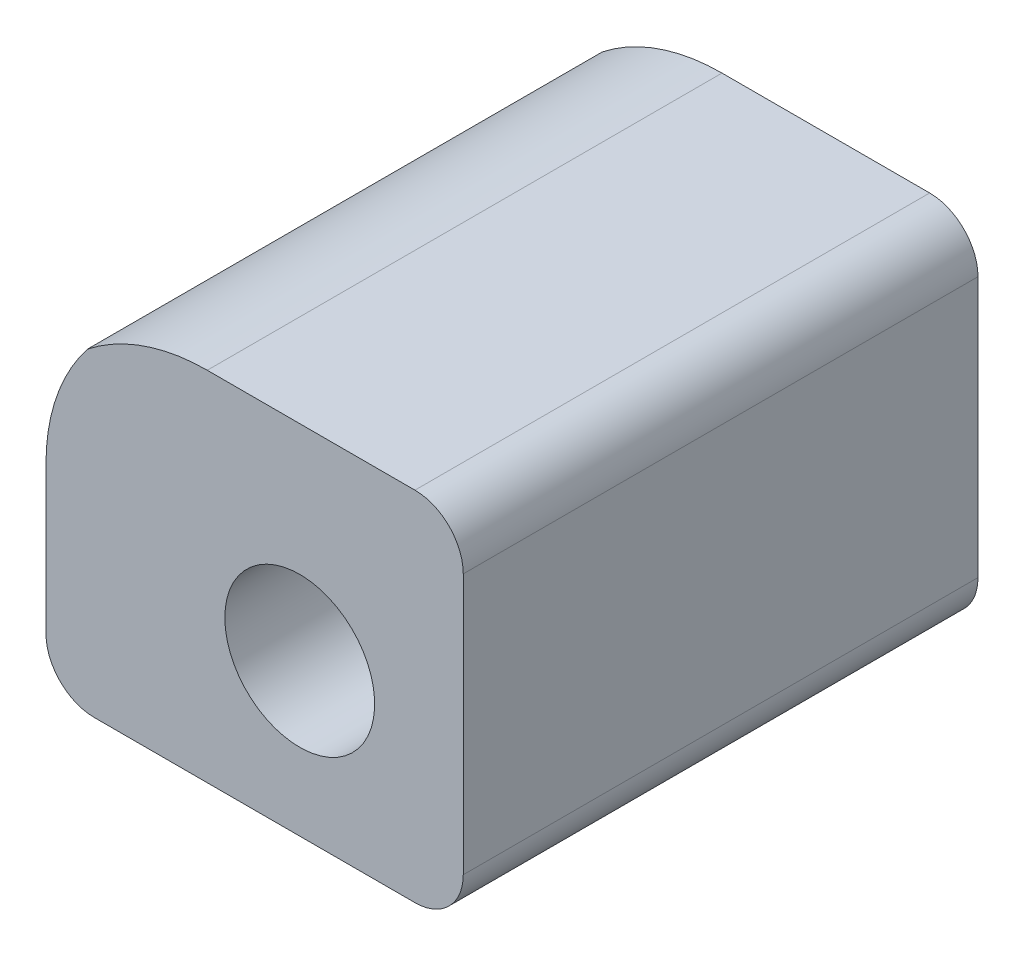
ISO-10303-21;
HEADER;
FILE_DESCRIPTION(('STEP AP214'),'2;1');
FILE_NAME('part.step','',(''),(''),'','','');
FILE_SCHEMA(('AUTOMOTIVE_DESIGN { 1 0 10303 214 1 1 1 1 }'));
ENDSEC;
DATA;
#1=APPLICATION_CONTEXT('core data for automotive mechanical design processes');
#2=APPLICATION_PROTOCOL_DEFINITION('international standard','automotive_design',2000,#1);
#3=PRODUCT_CONTEXT('',#1,'mechanical');
#4=PRODUCT('Part','Part','',(#3));
#5=PRODUCT_RELATED_PRODUCT_CATEGORY('part','',(#4));
#6=PRODUCT_DEFINITION_FORMATION('','',#4);
#7=PRODUCT_DEFINITION_CONTEXT('part definition',#1,'design');
#8=PRODUCT_DEFINITION('design','',#6,#7);
#9=PRODUCT_DEFINITION_SHAPE('','',#8);
#10=(LENGTH_UNIT() NAMED_UNIT(*) SI_UNIT(.MILLI.,.METRE.));
#11=(NAMED_UNIT(*) PLANE_ANGLE_UNIT() SI_UNIT($,.RADIAN.));
#12=(NAMED_UNIT(*) SI_UNIT($,.STERADIAN.) SOLID_ANGLE_UNIT());
#13=UNCERTAINTY_MEASURE_WITH_UNIT(LENGTH_MEASURE(1.E-05),#10,'distance_accuracy_value','');
#14=(GEOMETRIC_REPRESENTATION_CONTEXT(3) GLOBAL_UNCERTAINTY_ASSIGNED_CONTEXT((#13)) GLOBAL_UNIT_ASSIGNED_CONTEXT((#10,
#11,#12)) REPRESENTATION_CONTEXT('',''));
#15=CARTESIAN_POINT('',(0.,0.,0.));
#16=DIRECTION('',(0.,0.,1.));
#17=DIRECTION('',(1.,0.,0.));
#18=AXIS2_PLACEMENT_3D('',#15,#16,#17);
#19=CARTESIAN_POINT('',(-86.9721144047282,46.5450159431184,28.8954822845057));
#20=DIRECTION('',(-1.,0.,0.));
#21=DIRECTION('',(0.,0.,1.));
#22=AXIS2_PLACEMENT_3D('',#19,#20,#21);
#23=PLANE('',#22);
#24=DIRECTION('',(0.,1.,0.));
#25=VECTOR('',#24,1.);
#26=CARTESIAN_POINT('',(-86.9721144047282,46.5450159431184,3.68));
#27=LINE('',#26,#25);
#28=CARTESIAN_POINT('',(-86.9721144047282,47.5450159431184,3.68));
#29=VERTEX_POINT('',#28);
#30=CARTESIAN_POINT('',(-86.9721144047282,52.9366397440849,3.68));
#31=VERTEX_POINT('',#30);
#32=EDGE_CURVE('E171',#29,#31,#27,.T.);
#33=ORIENTED_EDGE('',*,*,#32,.T.);
#34=DIRECTION('',(0.,0.,-1.));
#35=VECTOR('',#34,1.);
#36=CARTESIAN_POINT('',(-86.9721144047282,52.9366397440849,28.8954822845057));
#37=LINE('',#36,#35);
#38=CARTESIAN_POINT('',(-86.9721144047282,52.9366397440849,14.33));
#39=VERTEX_POINT('',#38);
#40=EDGE_CURVE('E154',#31,#39,#37,.F.);
#41=ORIENTED_EDGE('',*,*,#40,.T.);
#42=DIRECTION('',(0.,1.,0.));
#43=VECTOR('',#42,1.);
#44=CARTESIAN_POINT('',(-86.9721144047282,46.5450159431184,14.33));
#45=LINE('',#44,#43);
#46=CARTESIAN_POINT('',(-86.9721144047282,47.5450159431184,14.33));
#47=VERTEX_POINT('',#46);
#48=EDGE_CURVE('E178',#47,#39,#45,.T.);
#49=ORIENTED_EDGE('',*,*,#48,.F.);
#50=DIRECTION('',(0.,0.,-1.));
#51=VECTOR('',#50,1.);
#52=CARTESIAN_POINT('',(-86.9721144047282,47.5450159431184,28.8954822845057));
#53=LINE('',#52,#51);
#54=EDGE_CURVE('E151',#47,#29,#53,.T.);
#55=ORIENTED_EDGE('',*,*,#54,.T.);
#56=EDGE_LOOP('',(#33,#41,#49,#55));
#57=FACE_BOUND('',#56,.T.);
#58=ADVANCED_FACE('F35',(#57),#23,.F.);
#59=CARTESIAN_POINT('',(-95.6056585868356,46.5450159431184,28.8954822845057));
#60=DIRECTION('',(0.,1.,0.));
#61=DIRECTION('',(0.,0.,1.));
#62=AXIS2_PLACEMENT_3D('',#59,#60,#61);
#63=PLANE('',#62);
#64=DIRECTION('',(1.,0.,0.));
#65=VECTOR('',#64,1.);
#66=CARTESIAN_POINT('',(-95.6056585868356,46.5450159431184,3.68));
#67=LINE('',#66,#65);
#68=CARTESIAN_POINT('',(-94.6056585868356,46.5450159431184,3.68));
#69=VERTEX_POINT('',#68);
#70=CARTESIAN_POINT('',(-87.9721144047282,46.5450159431184,3.68));
#71=VERTEX_POINT('',#70);
#72=EDGE_CURVE('E166',#69,#71,#67,.T.);
#73=ORIENTED_EDGE('',*,*,#72,.T.);
#74=DIRECTION('',(0.,0.,-1.));
#75=VECTOR('',#74,1.);
#76=CARTESIAN_POINT('',(-87.9721144047282,46.5450159431184,28.8954822845057));
#77=LINE('',#76,#75);
#78=CARTESIAN_POINT('',(-87.9721144047282,46.5450159431184,14.33));
#79=VERTEX_POINT('',#78);
#80=EDGE_CURVE('E43',#71,#79,#77,.F.);
#81=ORIENTED_EDGE('',*,*,#80,.T.);
#82=DIRECTION('',(1.,0.,0.));
#83=VECTOR('',#82,1.);
#84=CARTESIAN_POINT('',(-95.6056585868356,46.5450159431184,14.33));
#85=LINE('',#84,#83);
#86=CARTESIAN_POINT('',(-94.6056585868356,46.5450159431184,14.33));
#87=VERTEX_POINT('',#86);
#88=EDGE_CURVE('E167',#87,#79,#85,.T.);
#89=ORIENTED_EDGE('',*,*,#88,.F.);
#90=DIRECTION('',(0.,0.,-1.));
#91=VECTOR('',#90,1.);
#92=CARTESIAN_POINT('',(-94.6056585868356,46.5450159431184,28.8954822845057));
#93=LINE('',#92,#91);
#94=EDGE_CURVE('E161',#87,#69,#93,.T.);
#95=ORIENTED_EDGE('',*,*,#94,.T.);
#96=EDGE_LOOP('',(#73,#81,#89,#95));
#97=FACE_BOUND('',#96,.T.);
#98=ADVANCED_FACE('F165',(#97),#63,.F.);
#99=CARTESIAN_POINT('',(-95.6056585868356,52.2566397440849,28.8954822845057));
#100=DIRECTION('',(1.,0.,0.));
#101=DIRECTION('',(0.,0.,-1.));
#102=AXIS2_PLACEMENT_3D('',#99,#100,#101);
#103=PLANE('',#102);
#104=DIRECTION('',(0.,-1.,0.));
#105=VECTOR('',#104,1.);
#106=CARTESIAN_POINT('',(-95.6056585868356,52.2566397440849,3.68));
#107=LINE('',#106,#105);
#108=CARTESIAN_POINT('',(-95.6056585868356,50.5997854945925,3.68));
#109=VERTEX_POINT('',#108);
#110=CARTESIAN_POINT('',(-95.6056585868356,47.5450159431184,3.68));
#111=VERTEX_POINT('',#110);
#112=EDGE_CURVE('E116',#109,#111,#107,.T.);
#113=ORIENTED_EDGE('',*,*,#112,.T.);
#114=DIRECTION('',(0.,0.,-1.));
#115=VECTOR('',#114,1.);
#116=CARTESIAN_POINT('',(-95.6056585868356,47.5450159431184,28.8954822845057));
#117=LINE('',#116,#115);
#118=CARTESIAN_POINT('',(-95.6056585868356,47.5450159431184,14.33));
#119=VERTEX_POINT('',#118);
#120=EDGE_CURVE('E11',#111,#119,#117,.F.);
#121=ORIENTED_EDGE('',*,*,#120,.T.);
#122=DIRECTION('',(0.,-1.,0.));
#123=VECTOR('',#122,1.);
#124=CARTESIAN_POINT('',(-95.6056585868356,52.2566397440849,14.33));
#125=LINE('',#124,#123);
#126=CARTESIAN_POINT('',(-95.6056585868356,50.5997854945925,14.33));
#127=VERTEX_POINT('',#126);
#128=EDGE_CURVE('E185',#127,#119,#125,.T.);
#129=ORIENTED_EDGE('',*,*,#128,.F.);
#130=DIRECTION('',(0.,0.,-1.));
#131=VECTOR('',#130,1.);
#132=CARTESIAN_POINT('',(-95.6056585868356,50.5997854945925,28.8954822845057));
#133=LINE('',#132,#131);
#134=EDGE_CURVE('E139',#127,#109,#133,.T.);
#135=ORIENTED_EDGE('',*,*,#134,.T.);
#136=EDGE_LOOP('',(#113,#121,#129,#135));
#137=FACE_BOUND('',#136,.T.);
#138=ADVANCED_FACE('F212',(#137),#103,.F.);
#139=CARTESIAN_POINT('',(-86.9721144047282,53.9366397440849,28.8954822845057));
#140=DIRECTION('',(0.,-1.,0.));
#141=DIRECTION('',(0.,0.,-1.));
#142=AXIS2_PLACEMENT_3D('',#139,#140,#141);
#143=PLANE('',#142);
#144=DIRECTION('',(-1.,0.,0.));
#145=VECTOR('',#144,1.);
#146=CARTESIAN_POINT('',(-86.9721144047282,53.9366397440849,14.33));
#147=LINE('',#146,#145);
#148=CARTESIAN_POINT('',(-87.9721144047282,53.9366397440849,14.33));
#149=VERTEX_POINT('',#148);
#150=CARTESIAN_POINT('',(-92.2688043373432,53.9366397440849,14.33));
#151=VERTEX_POINT('',#150);
#152=EDGE_CURVE('E189',#149,#151,#147,.T.);
#153=ORIENTED_EDGE('',*,*,#152,.F.);
#154=DIRECTION('',(0.,0.,-1.));
#155=VECTOR('',#154,1.);
#156=CARTESIAN_POINT('',(-87.9721144047282,53.9366397440849,28.8954822845057));
#157=LINE('',#156,#155);
#158=CARTESIAN_POINT('',(-87.9721144047282,53.9366397440849,3.68));
#159=VERTEX_POINT('',#158);
#160=EDGE_CURVE('E114',#149,#159,#157,.T.);
#161=ORIENTED_EDGE('',*,*,#160,.T.);
#162=DIRECTION('',(-1.,0.,0.));
#163=VECTOR('',#162,1.);
#164=CARTESIAN_POINT('',(-86.9721144047282,53.9366397440849,3.68));
#165=LINE('',#164,#163);
#166=CARTESIAN_POINT('',(-92.2688043373432,53.9366397440849,3.68));
#167=VERTEX_POINT('',#166);
#168=EDGE_CURVE('E107',#159,#167,#165,.T.);
#169=ORIENTED_EDGE('',*,*,#168,.T.);
#170=DIRECTION('',(0.,0.,-1.));
#171=VECTOR('',#170,1.);
#172=CARTESIAN_POINT('',(-92.2688043373432,53.9366397440849,28.8954822845057));
#173=LINE('',#172,#171);
#174=EDGE_CURVE('E112',#167,#151,#173,.F.);
#175=ORIENTED_EDGE('',*,*,#174,.T.);
#176=EDGE_LOOP('',(#153,#161,#169,#175));
#177=FACE_BOUND('',#176,.T.);
#178=ADVANCED_FACE('F110',(#177),#143,.F.);
#179=CARTESIAN_POINT('',(0.,0.,3.68));
#180=DIRECTION('',(0.,0.,1.));
#181=DIRECTION('',(1.,0.,0.));
#182=AXIS2_PLACEMENT_3D('',#179,#180,#181);
#183=PLANE('',#182);
#184=ORIENTED_EDGE('',*,*,#168,.F.);
#185=CARTESIAN_POINT('',(-87.9721144047282,52.9366397440849,3.68));
#186=DIRECTION('',(0.,0.,1.));
#187=DIRECTION('',(1.,0.,0.));
#188=AXIS2_PLACEMENT_3D('',#185,#186,#187);
#189=CIRCLE('',#188,1.);
#190=EDGE_CURVE('E149',#159,#31,#189,.F.);
#191=ORIENTED_EDGE('',*,*,#190,.T.);
#192=ORIENTED_EDGE('',*,*,#32,.F.);
#193=CARTESIAN_POINT('',(-87.9721144047282,47.5450159431184,3.68));
#194=DIRECTION('',(0.,0.,1.));
#195=DIRECTION('',(1.,0.,0.));
#196=AXIS2_PLACEMENT_3D('',#193,#194,#195);
#197=CIRCLE('',#196,1.);
#198=EDGE_CURVE('E147',#29,#71,#197,.F.);
#199=ORIENTED_EDGE('',*,*,#198,.T.);
#200=ORIENTED_EDGE('',*,*,#72,.F.);
#201=CARTESIAN_POINT('',(-94.6056585868356,47.5450159431184,3.68));
#202=DIRECTION('',(0.,0.,1.));
#203=DIRECTION('',(1.,0.,0.));
#204=AXIS2_PLACEMENT_3D('',#201,#202,#203);
#205=CIRCLE('',#204,1.);
#206=EDGE_CURVE('E145',#69,#111,#205,.F.);
#207=ORIENTED_EDGE('',*,*,#206,.T.);
#208=ORIENTED_EDGE('',*,*,#112,.F.);
#209=CARTESIAN_POINT('',(-91.6056585868356,50.5997854945925,3.68));
#210=DIRECTION('',(0.,0.,1.));
#211=DIRECTION('',(1.,0.,0.));
#212=AXIS2_PLACEMENT_3D('',#209,#210,#211);
#213=CIRCLE('',#212,4.);
#214=CARTESIAN_POINT('',(-94.7461564216417,53.077137578891,3.68));
#215=VERTEX_POINT('',#214);
#216=EDGE_CURVE('E125',#109,#215,#213,.F.);
#217=ORIENTED_EDGE('',*,*,#216,.T.);
#218=CARTESIAN_POINT('',(-92.2688043373432,49.9366397440849,3.68));
#219=DIRECTION('',(0.,0.,1.));
#220=DIRECTION('',(1.,0.,0.));
#221=AXIS2_PLACEMENT_3D('',#218,#219,#220);
#222=CIRCLE('',#221,4.);
#223=EDGE_CURVE('E120',#215,#167,#222,.F.);
#224=ORIENTED_EDGE('',*,*,#223,.T.);
#225=EDGE_LOOP('',(#184,#191,#192,#199,#200,#207,#208,#217,#224));
#226=FACE_BOUND('',#225,.T.);
#227=CARTESIAN_POINT('',(-90.3556585868356,49.6866397440849,3.68));
#228=DIRECTION('',(0.,0.,1.));
#229=DIRECTION('',(1.,0.,0.));
#230=AXIS2_PLACEMENT_3D('',#227,#228,#229);
#231=CIRCLE('',#230,1.54999999999999);
#232=CARTESIAN_POINT('',(-91.9056585868356,49.6866397440849,3.68));
#233=VERTEX_POINT('',#232);
#234=EDGE_CURVE('E117',#233,#233,#231,.T.);
#235=ORIENTED_EDGE('',*,*,#234,.T.);
#236=EDGE_LOOP('',(#235));
#237=FACE_BOUND('',#236,.T.);
#238=ADVANCED_FACE('F121',(#226,#237),#183,.F.);
#239=CARTESIAN_POINT('',(-90.3556585868356,49.6866397440849,28.8954822845057));
#240=DIRECTION('',(0.,0.,-1.));
#241=DIRECTION('',(-1.,0.,0.));
#242=AXIS2_PLACEMENT_3D('',#239,#240,#241);
#243=CYLINDRICAL_SURFACE('',#242,1.54999999999999);
#244=CARTESIAN_POINT('',(-90.3556585868356,49.6866397440849,14.33));
#245=DIRECTION('',(0.,0.,1.));
#246=DIRECTION('',(1.,0.,0.));
#247=AXIS2_PLACEMENT_3D('',#244,#245,#246);
#248=CIRCLE('',#247,1.54999999999999);
#249=CARTESIAN_POINT('',(-91.9056585868356,49.6866397440849,14.33));
#250=VERTEX_POINT('',#249);
#251=EDGE_CURVE('E143',#250,#250,#248,.T.);
#252=CARTESIAN_POINT('',(-91.9056585868356,49.6866397440849,3.68));
#253=CARTESIAN_POINT('',(-91.9056585868356,49.6866397440849,3.7909375));
#254=CARTESIAN_POINT('',(-91.9056585868356,49.6866397440849,3.901875));
#255=CARTESIAN_POINT('',(-91.9056585868356,49.6866397440849,4.12375));
#256=CARTESIAN_POINT('',(-91.9056585868356,49.6866397440849,4.2346875));
#257=CARTESIAN_POINT('',(-91.9056585868356,49.6866397440849,4.4565625));
#258=CARTESIAN_POINT('',(-91.9056585868356,49.6866397440849,4.5675));
#259=CARTESIAN_POINT('',(-91.9056585868356,49.6866397440849,4.789375));
#260=CARTESIAN_POINT('',(-91.9056585868356,49.6866397440849,4.9003125));
#261=CARTESIAN_POINT('',(-91.9056585868356,49.6866397440849,5.1221875));
#262=CARTESIAN_POINT('',(-91.9056585868356,49.6866397440849,5.233125));
#263=CARTESIAN_POINT('',(-91.9056585868356,49.6866397440849,5.455));
#264=CARTESIAN_POINT('',(-91.9056585868356,49.6866397440849,5.5659375));
#265=CARTESIAN_POINT('',(-91.9056585868356,49.6866397440849,5.7878125));
#266=CARTESIAN_POINT('',(-91.9056585868356,49.6866397440849,5.89875));
#267=CARTESIAN_POINT('',(-91.9056585868356,49.6866397440849,6.120625));
#268=CARTESIAN_POINT('',(-91.9056585868356,49.6866397440849,6.2315625));
#269=CARTESIAN_POINT('',(-91.9056585868356,49.6866397440849,6.4534375));
#270=CARTESIAN_POINT('',(-91.9056585868356,49.6866397440849,6.564375));
#271=CARTESIAN_POINT('',(-91.9056585868356,49.6866397440849,6.78625));
#272=CARTESIAN_POINT('',(-91.9056585868356,49.6866397440849,6.8971875));
#273=CARTESIAN_POINT('',(-91.9056585868356,49.6866397440849,7.1190625));
#274=CARTESIAN_POINT('',(-91.9056585868356,49.6866397440849,7.23));
#275=CARTESIAN_POINT('',(-91.9056585868356,49.6866397440849,7.451875));
#276=CARTESIAN_POINT('',(-91.9056585868356,49.6866397440849,7.5628125));
#277=CARTESIAN_POINT('',(-91.9056585868356,49.6866397440849,7.7846875));
#278=CARTESIAN_POINT('',(-91.9056585868356,49.6866397440849,7.895625));
#279=CARTESIAN_POINT('',(-91.9056585868356,49.6866397440849,8.1175));
#280=CARTESIAN_POINT('',(-91.9056585868356,49.6866397440849,8.2284375));
#281=CARTESIAN_POINT('',(-91.9056585868356,49.6866397440849,8.4503125));
#282=CARTESIAN_POINT('',(-91.9056585868356,49.6866397440849,8.56125));
#283=CARTESIAN_POINT('',(-91.9056585868356,49.6866397440849,8.783125));
#284=CARTESIAN_POINT('',(-91.9056585868356,49.6866397440849,8.8940625));
#285=CARTESIAN_POINT('',(-91.9056585868356,49.6866397440849,9.1159375));
#286=CARTESIAN_POINT('',(-91.9056585868356,49.6866397440849,9.226875));
#287=CARTESIAN_POINT('',(-91.9056585868356,49.6866397440849,9.44875));
#288=CARTESIAN_POINT('',(-91.9056585868356,49.6866397440849,9.5596875));
#289=CARTESIAN_POINT('',(-91.9056585868356,49.6866397440849,9.7815625));
#290=CARTESIAN_POINT('',(-91.9056585868356,49.6866397440849,9.8925));
#291=CARTESIAN_POINT('',(-91.9056585868356,49.6866397440849,10.114375));
#292=CARTESIAN_POINT('',(-91.9056585868356,49.6866397440849,10.2253125));
#293=CARTESIAN_POINT('',(-91.9056585868356,49.6866397440849,10.4471875));
#294=CARTESIAN_POINT('',(-91.9056585868356,49.6866397440849,10.558125));
#295=CARTESIAN_POINT('',(-91.9056585868356,49.6866397440849,10.78));
#296=CARTESIAN_POINT('',(-91.9056585868356,49.6866397440849,10.8909375));
#297=CARTESIAN_POINT('',(-91.9056585868356,49.6866397440849,11.1128125));
#298=CARTESIAN_POINT('',(-91.9056585868356,49.6866397440849,11.22375));
#299=CARTESIAN_POINT('',(-91.9056585868356,49.6866397440849,11.445625));
#300=CARTESIAN_POINT('',(-91.9056585868356,49.6866397440849,11.5565625));
#301=CARTESIAN_POINT('',(-91.9056585868356,49.6866397440849,11.7784375));
#302=CARTESIAN_POINT('',(-91.9056585868356,49.6866397440849,11.889375));
#303=CARTESIAN_POINT('',(-91.9056585868356,49.6866397440849,12.11125));
#304=CARTESIAN_POINT('',(-91.9056585868356,49.6866397440849,12.2221875));
#305=CARTESIAN_POINT('',(-91.9056585868356,49.6866397440849,12.4440625));
#306=CARTESIAN_POINT('',(-91.9056585868356,49.6866397440849,12.555));
#307=CARTESIAN_POINT('',(-91.9056585868356,49.6866397440849,12.776875));
#308=CARTESIAN_POINT('',(-91.9056585868356,49.6866397440849,12.8878125));
#309=CARTESIAN_POINT('',(-91.9056585868356,49.6866397440849,13.1096875));
#310=CARTESIAN_POINT('',(-91.9056585868356,49.6866397440849,13.220625));
#311=CARTESIAN_POINT('',(-91.9056585868356,49.6866397440849,13.4425));
#312=CARTESIAN_POINT('',(-91.9056585868356,49.6866397440849,13.5534375));
#313=CARTESIAN_POINT('',(-91.9056585868356,49.6866397440849,13.7753125));
#314=CARTESIAN_POINT('',(-91.9056585868356,49.6866397440849,13.88625));
#315=CARTESIAN_POINT('',(-91.9056585868356,49.6866397440849,14.108125));
#316=CARTESIAN_POINT('',(-91.9056585868356,49.6866397440849,14.2190625));
#317=CARTESIAN_POINT('',(-91.9056585868356,49.6866397440849,14.33));
#318=B_SPLINE_CURVE_WITH_KNOTS('',3,(#252,#253,#254,#255,#256,#257,#258,#259,#260,#261,#262,
#263,#264,#265,#266,#267,#268,#269,#270,#271,#272,#273,#274,#275,#276,#277,#278,#279,#280,#281,
#282,#283,#284,#285,#286,#287,#288,#289,#290,#291,#292,#293,#294,#295,#296,#297,#298,#299,#300,
#301,#302,#303,#304,#305,#306,#307,#308,#309,#310,#311,#312,#313,#314,#315,#316,#317),
.UNSPECIFIED.,.F.,.F.,(4,2,2,2,2,2,2,2,2,2,2,2,2,2,2,2,2,2,2,2,2,2,2,2,2,2,2,2,2,2,2,2,4),(0.,
0.332812500000002,0.665625,0.998437500000001,1.33125,1.6640625,1.996875,2.3296875,2.6625,
2.9953125,3.328125,3.6609375,3.99375,4.3265625,4.659375,4.9921875,5.325,5.6578125,5.990625,
6.3234375,6.65625,6.9890625,7.321875,7.6546875,7.9875,8.3203125,8.653125,8.9859375,9.31875,
9.6515625,9.984375,10.3171875,10.65),.UNSPECIFIED.);
#319=EDGE_CURVE('BSEAM194',#233,#250,#318,.T.);
#320=ORIENTED_EDGE('',*,*,#234,.F.);
#321=ORIENTED_EDGE('',*,*,#251,.T.);
#322=ORIENTED_EDGE('',*,*,#319,.T.);
#323=ORIENTED_EDGE('',*,*,#319,.F.);
#324=EDGE_LOOP('',(#320,#322,#321,#323));
#325=FACE_BOUND('',#324,.T.);
#326=ADVANCED_FACE('F194',(#325),#243,.F.);
#327=CARTESIAN_POINT('',(0.,0.,14.33));
#328=DIRECTION('',(0.,0.,1.));
#329=DIRECTION('',(1.,0.,0.));
#330=AXIS2_PLACEMENT_3D('',#327,#328,#329);
#331=PLANE('',#330);
#332=ORIENTED_EDGE('',*,*,#251,.F.);
#333=EDGE_LOOP('',(#332));
#334=FACE_BOUND('',#333,.T.);
#335=ORIENTED_EDGE('',*,*,#48,.T.);
#336=CARTESIAN_POINT('',(-87.9721144047282,52.9366397440849,14.33));
#337=DIRECTION('',(0.,0.,1.));
#338=DIRECTION('',(1.,0.,0.));
#339=AXIS2_PLACEMENT_3D('',#336,#337,#338);
#340=CIRCLE('',#339,1.);
#341=EDGE_CURVE('E159',#39,#149,#340,.T.);
#342=ORIENTED_EDGE('',*,*,#341,.T.);
#343=ORIENTED_EDGE('',*,*,#152,.T.);
#344=CARTESIAN_POINT('',(-92.2688043373432,49.9366397440849,14.33));
#345=DIRECTION('',(0.,0.,1.));
#346=DIRECTION('',(1.,0.,0.));
#347=AXIS2_PLACEMENT_3D('',#344,#345,#346);
#348=CIRCLE('',#347,4.);
#349=CARTESIAN_POINT('',(-94.7461564216417,53.077137578891,14.33));
#350=VERTEX_POINT('',#349);
#351=EDGE_CURVE('E132',#151,#350,#348,.T.);
#352=ORIENTED_EDGE('',*,*,#351,.T.);
#353=CARTESIAN_POINT('',(-91.6056585868356,50.5997854945925,14.33));
#354=DIRECTION('',(0.,0.,1.));
#355=DIRECTION('',(1.,0.,0.));
#356=AXIS2_PLACEMENT_3D('',#353,#354,#355);
#357=CIRCLE('',#356,4.);
#358=EDGE_CURVE('E133',#350,#127,#357,.T.);
#359=ORIENTED_EDGE('',*,*,#358,.T.);
#360=ORIENTED_EDGE('',*,*,#128,.T.);
#361=CARTESIAN_POINT('',(-94.6056585868356,47.5450159431184,14.33));
#362=DIRECTION('',(0.,0.,1.));
#363=DIRECTION('',(1.,0.,0.));
#364=AXIS2_PLACEMENT_3D('',#361,#362,#363);
#365=CIRCLE('',#364,1.);
#366=EDGE_CURVE('E56',#119,#87,#365,.T.);
#367=ORIENTED_EDGE('',*,*,#366,.T.);
#368=ORIENTED_EDGE('',*,*,#88,.T.);
#369=CARTESIAN_POINT('',(-87.9721144047282,47.5450159431184,14.33));
#370=DIRECTION('',(0.,0.,1.));
#371=DIRECTION('',(1.,0.,0.));
#372=AXIS2_PLACEMENT_3D('',#369,#370,#371);
#373=CIRCLE('',#372,1.);
#374=EDGE_CURVE('E157',#79,#47,#373,.T.);
#375=ORIENTED_EDGE('',*,*,#374,.T.);
#376=EDGE_LOOP('',(#335,#342,#343,#352,#359,#360,#367,#368,#375));
#377=FACE_BOUND('',#376,.T.);
#378=ADVANCED_FACE('F196',(#334,#377),#331,.T.);
#379=CARTESIAN_POINT('',(-91.6056585868356,50.5997854945925,28.8954822845057));
#380=DIRECTION('',(0.,0.,-1.));
#381=DIRECTION('',(-1.,0.,0.));
#382=AXIS2_PLACEMENT_3D('',#379,#380,#381);
#383=CYLINDRICAL_SURFACE('',#382,4.);
#384=ORIENTED_EDGE('',*,*,#134,.F.);
#385=ORIENTED_EDGE('',*,*,#358,.F.);
#386=DIRECTION('',(0.,0.,-1.));
#387=VECTOR('',#386,1.);
#388=CARTESIAN_POINT('',(-94.7461564216417,53.077137578891,9.005));
#389=LINE('',#388,#387);
#390=EDGE_CURVE('E141',#215,#350,#389,.F.);
#391=ORIENTED_EDGE('',*,*,#390,.F.);
#392=ORIENTED_EDGE('',*,*,#216,.F.);
#393=EDGE_LOOP('',(#384,#385,#391,#392));
#394=FACE_BOUND('',#393,.T.);
#395=ADVANCED_FACE('F202',(#394),#383,.T.);
#396=CARTESIAN_POINT('',(-92.2688043373432,49.9366397440849,28.8954822845057));
#397=DIRECTION('',(0.,0.,-1.));
#398=DIRECTION('',(-1.,0.,0.));
#399=AXIS2_PLACEMENT_3D('',#396,#397,#398);
#400=CYLINDRICAL_SURFACE('',#399,4.);
#401=ORIENTED_EDGE('',*,*,#351,.F.);
#402=ORIENTED_EDGE('',*,*,#174,.F.);
#403=ORIENTED_EDGE('',*,*,#223,.F.);
#404=ORIENTED_EDGE('',*,*,#390,.T.);
#405=EDGE_LOOP('',(#401,#402,#403,#404));
#406=FACE_BOUND('',#405,.T.);
#407=ADVANCED_FACE('F131',(#406),#400,.T.);
#408=CARTESIAN_POINT('',(-87.9721144047282,52.9366397440849,28.8954822845057));
#409=DIRECTION('',(0.,0.,-1.));
#410=DIRECTION('',(-1.,0.,0.));
#411=AXIS2_PLACEMENT_3D('',#408,#409,#410);
#412=CYLINDRICAL_SURFACE('',#411,1.);
#413=ORIENTED_EDGE('',*,*,#341,.F.);
#414=ORIENTED_EDGE('',*,*,#40,.F.);
#415=ORIENTED_EDGE('',*,*,#190,.F.);
#416=ORIENTED_EDGE('',*,*,#160,.F.);
#417=EDGE_LOOP('',(#413,#414,#415,#416));
#418=FACE_BOUND('',#417,.T.);
#419=ADVANCED_FACE('F222',(#418),#412,.T.);
#420=CARTESIAN_POINT('',(-87.9721144047282,47.5450159431184,28.8954822845057));
#421=DIRECTION('',(0.,0.,-1.));
#422=DIRECTION('',(-1.,0.,0.));
#423=AXIS2_PLACEMENT_3D('',#420,#421,#422);
#424=CYLINDRICAL_SURFACE('',#423,1.);
#425=ORIENTED_EDGE('',*,*,#374,.F.);
#426=ORIENTED_EDGE('',*,*,#80,.F.);
#427=ORIENTED_EDGE('',*,*,#198,.F.);
#428=ORIENTED_EDGE('',*,*,#54,.F.);
#429=EDGE_LOOP('',(#425,#426,#427,#428));
#430=FACE_BOUND('',#429,.T.);
#431=ADVANCED_FACE('F227',(#430),#424,.T.);
#432=CARTESIAN_POINT('',(-94.6056585868356,47.5450159431184,28.8954822845057));
#433=DIRECTION('',(0.,0.,-1.));
#434=DIRECTION('',(-1.,0.,0.));
#435=AXIS2_PLACEMENT_3D('',#432,#433,#434);
#436=CYLINDRICAL_SURFACE('',#435,1.);
#437=ORIENTED_EDGE('',*,*,#366,.F.);
#438=ORIENTED_EDGE('',*,*,#120,.F.);
#439=ORIENTED_EDGE('',*,*,#206,.F.);
#440=ORIENTED_EDGE('',*,*,#94,.F.);
#441=EDGE_LOOP('',(#437,#438,#439,#440));
#442=FACE_BOUND('',#441,.T.);
#443=ADVANCED_FACE('F37',(#442),#436,.T.);
#444=CLOSED_SHELL('',(#58,#98,#138,#178,#238,#326,#378,#395,#407,#419,#431,#443));
#445=MANIFOLD_SOLID_BREP('B2',#444);
#446=ADVANCED_BREP_SHAPE_REPRESENTATION('',(#18,#445),#14);
#447=SHAPE_DEFINITION_REPRESENTATION(#9,#446);
ENDSEC;
END-ISO-10303-21;
